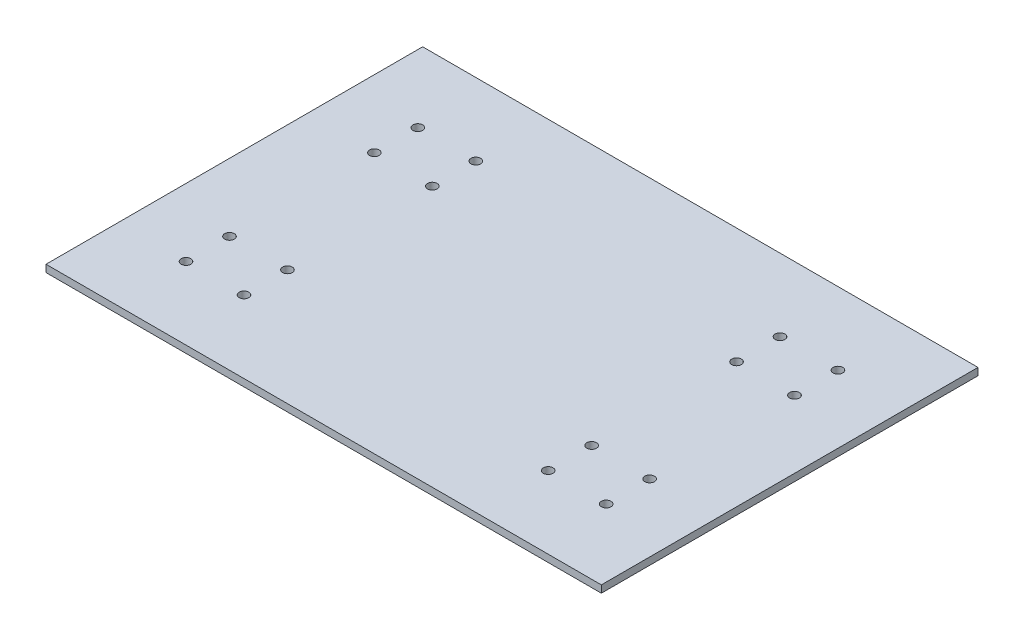
ISO-10303-21;
HEADER;
FILE_DESCRIPTION(('STEP AP214'),'2;1');
FILE_NAME('part.step','',(''),(''),'','','');
FILE_SCHEMA(('AUTOMOTIVE_DESIGN { 1 0 10303 214 1 1 1 1 }'));
ENDSEC;
DATA;
#1=APPLICATION_CONTEXT('core data for automotive mechanical design processes');
#2=APPLICATION_PROTOCOL_DEFINITION('international standard','automotive_design',2000,#1);
#3=PRODUCT_CONTEXT('',#1,'mechanical');
#4=PRODUCT('Part','Part','',(#3));
#5=PRODUCT_RELATED_PRODUCT_CATEGORY('part','',(#4));
#6=PRODUCT_DEFINITION_FORMATION('','',#4);
#7=PRODUCT_DEFINITION_CONTEXT('part definition',#1,'design');
#8=PRODUCT_DEFINITION('design','',#6,#7);
#9=PRODUCT_DEFINITION_SHAPE('','',#8);
#10=(LENGTH_UNIT() NAMED_UNIT(*) SI_UNIT(.MILLI.,.METRE.));
#11=(NAMED_UNIT(*) PLANE_ANGLE_UNIT() SI_UNIT($,.RADIAN.));
#12=(NAMED_UNIT(*) SI_UNIT($,.STERADIAN.) SOLID_ANGLE_UNIT());
#13=UNCERTAINTY_MEASURE_WITH_UNIT(LENGTH_MEASURE(1.E-05),#10,'distance_accuracy_value','');
#14=(GEOMETRIC_REPRESENTATION_CONTEXT(3) GLOBAL_UNCERTAINTY_ASSIGNED_CONTEXT((#13)) GLOBAL_UNIT_ASSIGNED_CONTEXT((#10,
#11,#12)) REPRESENTATION_CONTEXT('',''));
#15=CARTESIAN_POINT('',(0.,0.,0.));
#16=DIRECTION('',(0.,0.,1.));
#17=DIRECTION('',(1.,0.,0.));
#18=AXIS2_PLACEMENT_3D('',#15,#16,#17);
#19=CARTESIAN_POINT('',(115.,3.,78.));
#20=DIRECTION('',(-1.,0.,0.));
#21=DIRECTION('',(0.,0.,1.));
#22=AXIS2_PLACEMENT_3D('',#19,#20,#21);
#23=PLANE('',#22);
#24=DIRECTION('',(0.,0.,-1.));
#25=VECTOR('',#24,1.);
#26=CARTESIAN_POINT('',(115.,0.,78.));
#27=LINE('',#26,#25);
#28=CARTESIAN_POINT('',(115.,0.,78.));
#29=VERTEX_POINT('',#28);
#30=CARTESIAN_POINT('',(115.,0.,-78.));
#31=VERTEX_POINT('',#30);
#32=EDGE_CURVE('E96',#29,#31,#27,.T.);
#33=ORIENTED_EDGE('',*,*,#32,.T.);
#34=DIRECTION('',(0.,-1.,0.));
#35=VECTOR('',#34,1.);
#36=CARTESIAN_POINT('',(115.,3.,-78.));
#37=LINE('',#36,#35);
#38=CARTESIAN_POINT('',(115.,3.,-78.));
#39=VERTEX_POINT('',#38);
#40=EDGE_CURVE('E11',#39,#31,#37,.T.);
#41=ORIENTED_EDGE('',*,*,#40,.F.);
#42=DIRECTION('',(0.,0.,-1.));
#43=VECTOR('',#42,1.);
#44=CARTESIAN_POINT('',(115.,3.,78.));
#45=LINE('',#44,#43);
#46=CARTESIAN_POINT('',(115.,3.,78.));
#47=VERTEX_POINT('',#46);
#48=EDGE_CURVE('E84',#47,#39,#45,.T.);
#49=ORIENTED_EDGE('',*,*,#48,.F.);
#50=DIRECTION('',(0.,-1.,0.));
#51=VECTOR('',#50,1.);
#52=CARTESIAN_POINT('',(115.,3.,78.));
#53=LINE('',#52,#51);
#54=EDGE_CURVE('E92',#47,#29,#53,.T.);
#55=ORIENTED_EDGE('',*,*,#54,.T.);
#56=EDGE_LOOP('',(#33,#41,#49,#55));
#57=FACE_BOUND('',#56,.T.);
#58=ADVANCED_FACE('F33',(#57),#23,.F.);
#59=CARTESIAN_POINT('',(-115.,3.,-78.));
#60=DIRECTION('',(0.,0.,1.));
#61=DIRECTION('',(1.,0.,0.));
#62=AXIS2_PLACEMENT_3D('',#59,#60,#61);
#63=PLANE('',#62);
#64=DIRECTION('',(-1.,0.,0.));
#65=VECTOR('',#64,1.);
#66=CARTESIAN_POINT('',(-115.,0.,-78.));
#67=LINE('',#66,#65);
#68=CARTESIAN_POINT('',(-115.,0.,-78.));
#69=VERTEX_POINT('',#68);
#70=EDGE_CURVE('E88',#31,#69,#67,.T.);
#71=ORIENTED_EDGE('',*,*,#70,.T.);
#72=DIRECTION('',(0.,-1.,0.));
#73=VECTOR('',#72,1.);
#74=CARTESIAN_POINT('',(-115.,3.,-78.));
#75=LINE('',#74,#73);
#76=CARTESIAN_POINT('',(-115.,3.,-78.));
#77=VERTEX_POINT('',#76);
#78=EDGE_CURVE('E41',#77,#69,#75,.T.);
#79=ORIENTED_EDGE('',*,*,#78,.F.);
#80=DIRECTION('',(-1.,0.,0.));
#81=VECTOR('',#80,1.);
#82=CARTESIAN_POINT('',(-115.,3.,-78.));
#83=LINE('',#82,#81);
#84=EDGE_CURVE('E79',#39,#77,#83,.T.);
#85=ORIENTED_EDGE('',*,*,#84,.F.);
#86=ORIENTED_EDGE('',*,*,#40,.T.);
#87=EDGE_LOOP('',(#71,#79,#85,#86));
#88=FACE_BOUND('',#87,.T.);
#89=ADVANCED_FACE('F87',(#88),#63,.F.);
#90=CARTESIAN_POINT('',(-115.,3.,78.));
#91=DIRECTION('',(1.,0.,0.));
#92=DIRECTION('',(0.,0.,-1.));
#93=AXIS2_PLACEMENT_3D('',#90,#91,#92);
#94=PLANE('',#93);
#95=DIRECTION('',(0.,0.,1.));
#96=VECTOR('',#95,1.);
#97=CARTESIAN_POINT('',(-115.,0.,78.));
#98=LINE('',#97,#96);
#99=CARTESIAN_POINT('',(-115.,0.,78.));
#100=VERTEX_POINT('',#99);
#101=EDGE_CURVE('E66',#69,#100,#98,.T.);
#102=ORIENTED_EDGE('',*,*,#101,.T.);
#103=DIRECTION('',(0.,-1.,0.));
#104=VECTOR('',#103,1.);
#105=CARTESIAN_POINT('',(-115.,3.,78.));
#106=LINE('',#105,#104);
#107=CARTESIAN_POINT('',(-115.,3.,78.));
#108=VERTEX_POINT('',#107);
#109=EDGE_CURVE('E89',#108,#100,#106,.T.);
#110=ORIENTED_EDGE('',*,*,#109,.F.);
#111=DIRECTION('',(0.,0.,1.));
#112=VECTOR('',#111,1.);
#113=CARTESIAN_POINT('',(-115.,3.,78.));
#114=LINE('',#113,#112);
#115=EDGE_CURVE('E82',#77,#108,#114,.T.);
#116=ORIENTED_EDGE('',*,*,#115,.F.);
#117=ORIENTED_EDGE('',*,*,#78,.T.);
#118=EDGE_LOOP('',(#102,#110,#116,#117));
#119=FACE_BOUND('',#118,.T.);
#120=ADVANCED_FACE('F90',(#119),#94,.F.);
#121=CARTESIAN_POINT('',(-115.,3.,78.));
#122=DIRECTION('',(0.,0.,-1.));
#123=DIRECTION('',(-1.,0.,0.));
#124=AXIS2_PLACEMENT_3D('',#121,#122,#123);
#125=PLANE('',#124);
#126=DIRECTION('',(1.,0.,0.));
#127=VECTOR('',#126,1.);
#128=CARTESIAN_POINT('',(-115.,0.,78.));
#129=LINE('',#128,#127);
#130=EDGE_CURVE('E72',#100,#29,#129,.T.);
#131=ORIENTED_EDGE('',*,*,#130,.T.);
#132=ORIENTED_EDGE('',*,*,#54,.F.);
#133=DIRECTION('',(1.,0.,0.));
#134=VECTOR('',#133,1.);
#135=CARTESIAN_POINT('',(-115.,3.,78.));
#136=LINE('',#135,#134);
#137=EDGE_CURVE('E49',#108,#47,#136,.T.);
#138=ORIENTED_EDGE('',*,*,#137,.F.);
#139=ORIENTED_EDGE('',*,*,#109,.T.);
#140=EDGE_LOOP('',(#131,#132,#138,#139));
#141=FACE_BOUND('',#140,.T.);
#142=ADVANCED_FACE('F104',(#141),#125,.F.);
#143=CARTESIAN_POINT('',(0.,3.,0.));
#144=DIRECTION('',(0.,-1.,0.));
#145=DIRECTION('',(0.,0.,-1.));
#146=AXIS2_PLACEMENT_3D('',#143,#144,#145);
#147=PLANE('',#146);
#148=CARTESIAN_POINT('',(-63.0000000000003,3.,47.9999999999995));
#149=DIRECTION('',(0.,1.,0.));
#150=DIRECTION('',(0.,0.,1.));
#151=AXIS2_PLACEMENT_3D('',#148,#149,#150);
#152=CIRCLE('',#151,2.);
#153=CARTESIAN_POINT('',(-63.0000000000003,3.,49.9999999999995));
#154=VERTEX_POINT('',#153);
#155=EDGE_CURVE('E140',#154,#154,#152,.T.);
#156=ORIENTED_EDGE('',*,*,#155,.F.);
#157=EDGE_LOOP('',(#156));
#158=FACE_BOUND('',#157,.T.);
#159=CARTESIAN_POINT('',(-63.0000000000003,3.,-47.9999999999995));
#160=DIRECTION('',(0.,1.,0.));
#161=DIRECTION('',(0.,0.,-1.));
#162=AXIS2_PLACEMENT_3D('',#159,#160,#161);
#163=CIRCLE('',#162,2.);
#164=CARTESIAN_POINT('',(-63.0000000000003,3.,-49.9999999999995));
#165=VERTEX_POINT('',#164);
#166=EDGE_CURVE('E147',#165,#165,#163,.T.);
#167=ORIENTED_EDGE('',*,*,#166,.F.);
#168=EDGE_LOOP('',(#167));
#169=FACE_BOUND('',#168,.T.);
#170=CARTESIAN_POINT('',(-87.0000000000003,3.,-47.9999999999995));
#171=DIRECTION('',(0.,1.,0.));
#172=DIRECTION('',(0.,0.,-1.));
#173=AXIS2_PLACEMENT_3D('',#170,#171,#172);
#174=CIRCLE('',#173,2.);
#175=CARTESIAN_POINT('',(-87.0000000000003,3.,-49.9999999999995));
#176=VERTEX_POINT('',#175);
#177=EDGE_CURVE('E153',#176,#176,#174,.T.);
#178=ORIENTED_EDGE('',*,*,#177,.F.);
#179=EDGE_LOOP('',(#178));
#180=FACE_BOUND('',#179,.T.);
#181=CARTESIAN_POINT('',(-87.0000000000002,3.,-29.9999999999995));
#182=DIRECTION('',(0.,1.,0.));
#183=DIRECTION('',(0.,0.,-1.));
#184=AXIS2_PLACEMENT_3D('',#181,#182,#183);
#185=CIRCLE('',#184,2.);
#186=CARTESIAN_POINT('',(-87.0000000000002,3.,-31.9999999999995));
#187=VERTEX_POINT('',#186);
#188=EDGE_CURVE('E159',#187,#187,#185,.T.);
#189=ORIENTED_EDGE('',*,*,#188,.F.);
#190=EDGE_LOOP('',(#189));
#191=FACE_BOUND('',#190,.T.);
#192=CARTESIAN_POINT('',(63.,3.,-47.9999999999999));
#193=DIRECTION('',(0.,1.,0.));
#194=DIRECTION('',(0.,0.,1.));
#195=AXIS2_PLACEMENT_3D('',#192,#193,#194);
#196=CIRCLE('',#195,2.);
#197=CARTESIAN_POINT('',(63.,3.,-45.9999999999999));
#198=VERTEX_POINT('',#197);
#199=EDGE_CURVE('E123',#198,#198,#196,.T.);
#200=ORIENTED_EDGE('',*,*,#199,.F.);
#201=EDGE_LOOP('',(#200));
#202=FACE_BOUND('',#201,.T.);
#203=CARTESIAN_POINT('',(87.,3.,-29.9999999999999));
#204=DIRECTION('',(0.,1.,0.));
#205=DIRECTION('',(0.,0.,1.));
#206=AXIS2_PLACEMENT_3D('',#203,#204,#205);
#207=CIRCLE('',#206,2.);
#208=CARTESIAN_POINT('',(87.,3.,-27.9999999999999));
#209=VERTEX_POINT('',#208);
#210=EDGE_CURVE('E116',#209,#209,#207,.T.);
#211=ORIENTED_EDGE('',*,*,#210,.F.);
#212=EDGE_LOOP('',(#211));
#213=FACE_BOUND('',#212,.T.);
#214=CARTESIAN_POINT('',(63.,3.,-29.9999999999999));
#215=DIRECTION('',(0.,1.,0.));
#216=DIRECTION('',(0.,0.,1.));
#217=AXIS2_PLACEMENT_3D('',#214,#215,#216);
#218=CIRCLE('',#217,2.);
#219=CARTESIAN_POINT('',(63.,3.,-27.9999999999999));
#220=VERTEX_POINT('',#219);
#221=EDGE_CURVE('E135',#220,#220,#218,.T.);
#222=ORIENTED_EDGE('',*,*,#221,.F.);
#223=EDGE_LOOP('',(#222));
#224=FACE_BOUND('',#223,.T.);
#225=CARTESIAN_POINT('',(-63.0000000000002,3.,-29.9999999999995));
#226=DIRECTION('',(0.,1.,0.));
#227=DIRECTION('',(0.,0.,-1.));
#228=AXIS2_PLACEMENT_3D('',#225,#226,#227);
#229=CIRCLE('',#228,2.);
#230=CARTESIAN_POINT('',(-63.0000000000002,3.,-31.9999999999995));
#231=VERTEX_POINT('',#230);
#232=EDGE_CURVE('E128',#231,#231,#229,.T.);
#233=ORIENTED_EDGE('',*,*,#232,.F.);
#234=EDGE_LOOP('',(#233));
#235=FACE_BOUND('',#234,.T.);
#236=CARTESIAN_POINT('',(63.,3.,47.9999999999999));
#237=DIRECTION('',(0.,1.,0.));
#238=DIRECTION('',(0.,0.,-1.));
#239=AXIS2_PLACEMENT_3D('',#236,#237,#238);
#240=CIRCLE('',#239,2.);
#241=CARTESIAN_POINT('',(63.,3.,45.9999999999999));
#242=VERTEX_POINT('',#241);
#243=EDGE_CURVE('E188',#242,#242,#240,.T.);
#244=ORIENTED_EDGE('',*,*,#243,.F.);
#245=EDGE_LOOP('',(#244));
#246=FACE_BOUND('',#245,.T.);
#247=CARTESIAN_POINT('',(87.,3.,47.9999999999999));
#248=DIRECTION('',(0.,1.,0.));
#249=DIRECTION('',(0.,0.,-1.));
#250=AXIS2_PLACEMENT_3D('',#247,#248,#249);
#251=CIRCLE('',#250,2.);
#252=CARTESIAN_POINT('',(87.,3.,45.9999999999999));
#253=VERTEX_POINT('',#252);
#254=EDGE_CURVE('E194',#253,#253,#251,.T.);
#255=ORIENTED_EDGE('',*,*,#254,.F.);
#256=EDGE_LOOP('',(#255));
#257=FACE_BOUND('',#256,.T.);
#258=CARTESIAN_POINT('',(87.,3.,29.9999999999999));
#259=DIRECTION('',(0.,1.,0.));
#260=DIRECTION('',(0.,0.,-1.));
#261=AXIS2_PLACEMENT_3D('',#258,#259,#260);
#262=CIRCLE('',#261,2.);
#263=CARTESIAN_POINT('',(87.,3.,27.9999999999999));
#264=VERTEX_POINT('',#263);
#265=EDGE_CURVE('E200',#264,#264,#262,.T.);
#266=ORIENTED_EDGE('',*,*,#265,.F.);
#267=EDGE_LOOP('',(#266));
#268=FACE_BOUND('',#267,.T.);
#269=CARTESIAN_POINT('',(63.,3.,29.9999999999999));
#270=DIRECTION('',(0.,1.,0.));
#271=DIRECTION('',(0.,0.,-1.));
#272=AXIS2_PLACEMENT_3D('',#269,#270,#271);
#273=CIRCLE('',#272,2.);
#274=CARTESIAN_POINT('',(63.,3.,27.9999999999999));
#275=VERTEX_POINT('',#274);
#276=EDGE_CURVE('E164',#275,#275,#273,.T.);
#277=ORIENTED_EDGE('',*,*,#276,.F.);
#278=EDGE_LOOP('',(#277));
#279=FACE_BOUND('',#278,.T.);
#280=CARTESIAN_POINT('',(-63.0000000000002,3.,29.9999999999995));
#281=DIRECTION('',(0.,1.,0.));
#282=DIRECTION('',(0.,0.,1.));
#283=AXIS2_PLACEMENT_3D('',#280,#281,#282);
#284=CIRCLE('',#283,2.);
#285=CARTESIAN_POINT('',(-63.0000000000002,3.,31.9999999999995));
#286=VERTEX_POINT('',#285);
#287=EDGE_CURVE('E171',#286,#286,#284,.T.);
#288=ORIENTED_EDGE('',*,*,#287,.F.);
#289=EDGE_LOOP('',(#288));
#290=FACE_BOUND('',#289,.T.);
#291=CARTESIAN_POINT('',(-87.0000000000002,3.,29.9999999999995));
#292=DIRECTION('',(0.,1.,0.));
#293=DIRECTION('',(0.,0.,1.));
#294=AXIS2_PLACEMENT_3D('',#291,#292,#293);
#295=CIRCLE('',#294,2.);
#296=CARTESIAN_POINT('',(-87.0000000000002,3.,31.9999999999995));
#297=VERTEX_POINT('',#296);
#298=EDGE_CURVE('E177',#297,#297,#295,.T.);
#299=ORIENTED_EDGE('',*,*,#298,.F.);
#300=EDGE_LOOP('',(#299));
#301=FACE_BOUND('',#300,.T.);
#302=CARTESIAN_POINT('',(-87.0000000000003,3.,47.9999999999995));
#303=DIRECTION('',(0.,1.,0.));
#304=DIRECTION('',(0.,0.,1.));
#305=AXIS2_PLACEMENT_3D('',#302,#303,#304);
#306=CIRCLE('',#305,2.);
#307=CARTESIAN_POINT('',(-87.0000000000003,3.,49.9999999999995));
#308=VERTEX_POINT('',#307);
#309=EDGE_CURVE('E183',#308,#308,#306,.T.);
#310=ORIENTED_EDGE('',*,*,#309,.F.);
#311=EDGE_LOOP('',(#310));
#312=FACE_BOUND('',#311,.T.);
#313=CARTESIAN_POINT('',(87.,3.,-47.9999999999999));
#314=DIRECTION('',(0.,1.,0.));
#315=DIRECTION('',(0.,0.,1.));
#316=AXIS2_PLACEMENT_3D('',#313,#314,#315);
#317=CIRCLE('',#316,2.);
#318=CARTESIAN_POINT('',(87.,3.,-45.9999999999999));
#319=VERTEX_POINT('',#318);
#320=EDGE_CURVE('E110',#319,#319,#317,.T.);
#321=ORIENTED_EDGE('',*,*,#320,.F.);
#322=EDGE_LOOP('',(#321));
#323=FACE_BOUND('',#322,.T.);
#324=ORIENTED_EDGE('',*,*,#48,.T.);
#325=ORIENTED_EDGE('',*,*,#84,.T.);
#326=ORIENTED_EDGE('',*,*,#115,.T.);
#327=ORIENTED_EDGE('',*,*,#137,.T.);
#328=EDGE_LOOP('',(#324,#325,#326,#327));
#329=FACE_BOUND('',#328,.T.);
#330=ADVANCED_FACE('F80',(#158,#169,#180,#191,#202,#213,#224,#235,#246,#257,#268,#279,#290,#301,
#312,#323,#329),#147,.F.);
#331=CARTESIAN_POINT('',(0.,0.,0.));
#332=DIRECTION('',(0.,-1.,0.));
#333=DIRECTION('',(0.,0.,-1.));
#334=AXIS2_PLACEMENT_3D('',#331,#332,#333);
#335=PLANE('',#334);
#336=CARTESIAN_POINT('',(-63.0000000000003,0.,47.9999999999995));
#337=DIRECTION('',(0.,1.,0.));
#338=DIRECTION('',(0.,0.,1.));
#339=AXIS2_PLACEMENT_3D('',#336,#337,#338);
#340=CIRCLE('',#339,2.);
#341=CARTESIAN_POINT('',(-63.0000000000003,0.,49.9999999999995));
#342=VERTEX_POINT('',#341);
#343=EDGE_CURVE('E143',#342,#342,#340,.T.);
#344=ORIENTED_EDGE('',*,*,#343,.T.);
#345=EDGE_LOOP('',(#344));
#346=FACE_BOUND('',#345,.T.);
#347=CARTESIAN_POINT('',(-63.0000000000003,0.,-47.9999999999995));
#348=DIRECTION('',(0.,1.,0.));
#349=DIRECTION('',(0.,0.,-1.));
#350=AXIS2_PLACEMENT_3D('',#347,#348,#349);
#351=CIRCLE('',#350,2.);
#352=CARTESIAN_POINT('',(-63.0000000000003,0.,-49.9999999999995));
#353=VERTEX_POINT('',#352);
#354=EDGE_CURVE('E150',#353,#353,#351,.T.);
#355=ORIENTED_EDGE('',*,*,#354,.T.);
#356=EDGE_LOOP('',(#355));
#357=FACE_BOUND('',#356,.T.);
#358=CARTESIAN_POINT('',(-87.0000000000003,0.,-47.9999999999995));
#359=DIRECTION('',(0.,1.,0.));
#360=DIRECTION('',(0.,0.,-1.));
#361=AXIS2_PLACEMENT_3D('',#358,#359,#360);
#362=CIRCLE('',#361,2.);
#363=CARTESIAN_POINT('',(-87.0000000000003,0.,-49.9999999999995));
#364=VERTEX_POINT('',#363);
#365=EDGE_CURVE('E156',#364,#364,#362,.T.);
#366=ORIENTED_EDGE('',*,*,#365,.T.);
#367=EDGE_LOOP('',(#366));
#368=FACE_BOUND('',#367,.T.);
#369=CARTESIAN_POINT('',(-87.0000000000002,0.,-29.9999999999995));
#370=DIRECTION('',(0.,1.,0.));
#371=DIRECTION('',(0.,0.,-1.));
#372=AXIS2_PLACEMENT_3D('',#369,#370,#371);
#373=CIRCLE('',#372,2.);
#374=CARTESIAN_POINT('',(-87.0000000000002,0.,-31.9999999999995));
#375=VERTEX_POINT('',#374);
#376=EDGE_CURVE('E132',#375,#375,#373,.T.);
#377=ORIENTED_EDGE('',*,*,#376,.T.);
#378=EDGE_LOOP('',(#377));
#379=FACE_BOUND('',#378,.T.);
#380=CARTESIAN_POINT('',(63.,0.,-47.9999999999999));
#381=DIRECTION('',(0.,1.,0.));
#382=DIRECTION('',(0.,0.,1.));
#383=AXIS2_PLACEMENT_3D('',#380,#381,#382);
#384=CIRCLE('',#383,2.);
#385=CARTESIAN_POINT('',(63.,0.,-45.9999999999999));
#386=VERTEX_POINT('',#385);
#387=EDGE_CURVE('E113',#386,#386,#384,.T.);
#388=ORIENTED_EDGE('',*,*,#387,.T.);
#389=EDGE_LOOP('',(#388));
#390=FACE_BOUND('',#389,.T.);
#391=CARTESIAN_POINT('',(87.,0.,-29.9999999999999));
#392=DIRECTION('',(0.,1.,0.));
#393=DIRECTION('',(0.,0.,1.));
#394=AXIS2_PLACEMENT_3D('',#391,#392,#393);
#395=CIRCLE('',#394,2.);
#396=CARTESIAN_POINT('',(87.,0.,-27.9999999999999));
#397=VERTEX_POINT('',#396);
#398=EDGE_CURVE('E119',#397,#397,#395,.T.);
#399=ORIENTED_EDGE('',*,*,#398,.T.);
#400=EDGE_LOOP('',(#399));
#401=FACE_BOUND('',#400,.T.);
#402=CARTESIAN_POINT('',(63.,0.,-29.9999999999999));
#403=DIRECTION('',(0.,1.,0.));
#404=DIRECTION('',(0.,0.,1.));
#405=AXIS2_PLACEMENT_3D('',#402,#403,#404);
#406=CIRCLE('',#405,2.);
#407=CARTESIAN_POINT('',(63.,0.,-27.9999999999999));
#408=VERTEX_POINT('',#407);
#409=EDGE_CURVE('E120',#408,#408,#406,.T.);
#410=ORIENTED_EDGE('',*,*,#409,.T.);
#411=EDGE_LOOP('',(#410));
#412=FACE_BOUND('',#411,.T.);
#413=CARTESIAN_POINT('',(-63.0000000000002,0.,-29.9999999999995));
#414=DIRECTION('',(0.,1.,0.));
#415=DIRECTION('',(0.,0.,-1.));
#416=AXIS2_PLACEMENT_3D('',#413,#414,#415);
#417=CIRCLE('',#416,2.);
#418=CARTESIAN_POINT('',(-63.0000000000002,0.,-31.9999999999995));
#419=VERTEX_POINT('',#418);
#420=EDGE_CURVE('E131',#419,#419,#417,.T.);
#421=ORIENTED_EDGE('',*,*,#420,.T.);
#422=EDGE_LOOP('',(#421));
#423=FACE_BOUND('',#422,.T.);
#424=CARTESIAN_POINT('',(63.,0.,47.9999999999999));
#425=DIRECTION('',(0.,1.,0.));
#426=DIRECTION('',(0.,0.,-1.));
#427=AXIS2_PLACEMENT_3D('',#424,#425,#426);
#428=CIRCLE('',#427,2.);
#429=CARTESIAN_POINT('',(63.,0.,45.9999999999999));
#430=VERTEX_POINT('',#429);
#431=EDGE_CURVE('E191',#430,#430,#428,.T.);
#432=ORIENTED_EDGE('',*,*,#431,.T.);
#433=EDGE_LOOP('',(#432));
#434=FACE_BOUND('',#433,.T.);
#435=CARTESIAN_POINT('',(87.,0.,47.9999999999999));
#436=DIRECTION('',(0.,1.,0.));
#437=DIRECTION('',(0.,0.,-1.));
#438=AXIS2_PLACEMENT_3D('',#435,#436,#437);
#439=CIRCLE('',#438,2.);
#440=CARTESIAN_POINT('',(87.,0.,45.9999999999999));
#441=VERTEX_POINT('',#440);
#442=EDGE_CURVE('E197',#441,#441,#439,.T.);
#443=ORIENTED_EDGE('',*,*,#442,.T.);
#444=EDGE_LOOP('',(#443));
#445=FACE_BOUND('',#444,.T.);
#446=CARTESIAN_POINT('',(87.,0.,29.9999999999999));
#447=DIRECTION('',(0.,1.,0.));
#448=DIRECTION('',(0.,0.,-1.));
#449=AXIS2_PLACEMENT_3D('',#446,#447,#448);
#450=CIRCLE('',#449,2.);
#451=CARTESIAN_POINT('',(87.,0.,27.9999999999999));
#452=VERTEX_POINT('',#451);
#453=EDGE_CURVE('E168',#452,#452,#450,.T.);
#454=ORIENTED_EDGE('',*,*,#453,.T.);
#455=EDGE_LOOP('',(#454));
#456=FACE_BOUND('',#455,.T.);
#457=CARTESIAN_POINT('',(63.,0.,29.9999999999999));
#458=DIRECTION('',(0.,1.,0.));
#459=DIRECTION('',(0.,0.,-1.));
#460=AXIS2_PLACEMENT_3D('',#457,#458,#459);
#461=CIRCLE('',#460,2.);
#462=CARTESIAN_POINT('',(63.,0.,27.9999999999999));
#463=VERTEX_POINT('',#462);
#464=EDGE_CURVE('E167',#463,#463,#461,.T.);
#465=ORIENTED_EDGE('',*,*,#464,.T.);
#466=EDGE_LOOP('',(#465));
#467=FACE_BOUND('',#466,.T.);
#468=CARTESIAN_POINT('',(-63.0000000000002,0.,29.9999999999995));
#469=DIRECTION('',(0.,1.,0.));
#470=DIRECTION('',(0.,0.,1.));
#471=AXIS2_PLACEMENT_3D('',#468,#469,#470);
#472=CIRCLE('',#471,2.);
#473=CARTESIAN_POINT('',(-63.0000000000002,0.,31.9999999999995));
#474=VERTEX_POINT('',#473);
#475=EDGE_CURVE('E174',#474,#474,#472,.T.);
#476=ORIENTED_EDGE('',*,*,#475,.T.);
#477=EDGE_LOOP('',(#476));
#478=FACE_BOUND('',#477,.T.);
#479=CARTESIAN_POINT('',(-87.0000000000002,0.,29.9999999999995));
#480=DIRECTION('',(0.,1.,0.));
#481=DIRECTION('',(0.,0.,1.));
#482=AXIS2_PLACEMENT_3D('',#479,#480,#481);
#483=CIRCLE('',#482,2.);
#484=CARTESIAN_POINT('',(-87.0000000000002,0.,31.9999999999995));
#485=VERTEX_POINT('',#484);
#486=EDGE_CURVE('E180',#485,#485,#483,.T.);
#487=ORIENTED_EDGE('',*,*,#486,.T.);
#488=EDGE_LOOP('',(#487));
#489=FACE_BOUND('',#488,.T.);
#490=CARTESIAN_POINT('',(-87.0000000000003,0.,47.9999999999995));
#491=DIRECTION('',(0.,1.,0.));
#492=DIRECTION('',(0.,0.,1.));
#493=AXIS2_PLACEMENT_3D('',#490,#491,#492);
#494=CIRCLE('',#493,2.);
#495=CARTESIAN_POINT('',(-87.0000000000003,0.,49.9999999999995));
#496=VERTEX_POINT('',#495);
#497=EDGE_CURVE('E144',#496,#496,#494,.T.);
#498=ORIENTED_EDGE('',*,*,#497,.T.);
#499=EDGE_LOOP('',(#498));
#500=FACE_BOUND('',#499,.T.);
#501=CARTESIAN_POINT('',(87.,0.,-47.9999999999999));
#502=DIRECTION('',(0.,1.,0.));
#503=DIRECTION('',(0.,0.,1.));
#504=AXIS2_PLACEMENT_3D('',#501,#502,#503);
#505=CIRCLE('',#504,2.);
#506=CARTESIAN_POINT('',(87.,0.,-45.9999999999999));
#507=VERTEX_POINT('',#506);
#508=EDGE_CURVE('E99',#507,#507,#505,.T.);
#509=ORIENTED_EDGE('',*,*,#508,.T.);
#510=EDGE_LOOP('',(#509));
#511=FACE_BOUND('',#510,.T.);
#512=ORIENTED_EDGE('',*,*,#32,.F.);
#513=ORIENTED_EDGE('',*,*,#130,.F.);
#514=ORIENTED_EDGE('',*,*,#101,.F.);
#515=ORIENTED_EDGE('',*,*,#70,.F.);
#516=EDGE_LOOP('',(#512,#513,#514,#515));
#517=FACE_BOUND('',#516,.T.);
#518=ADVANCED_FACE('F107',(#346,#357,#368,#379,#390,#401,#412,#423,#434,#445,#456,#467,#478,
#489,#500,#511,#517),#335,.T.);
#519=CARTESIAN_POINT('',(87.,0.,-47.9999999999999));
#520=DIRECTION('',(0.,1.,0.));
#521=DIRECTION('',(0.,0.,1.));
#522=AXIS2_PLACEMENT_3D('',#519,#520,#521);
#523=CYLINDRICAL_SURFACE('',#522,2.);
#524=ORIENTED_EDGE('',*,*,#508,.F.);
#525=EDGE_LOOP('',(#524));
#526=FACE_BOUND('',#525,.T.);
#527=ORIENTED_EDGE('',*,*,#320,.T.);
#528=EDGE_LOOP('',(#527));
#529=FACE_BOUND('',#528,.T.);
#530=ADVANCED_FACE('F230',(#526,#529),#523,.F.);
#531=CARTESIAN_POINT('',(-87.0000000000003,0.,47.9999999999995));
#532=DIRECTION('',(0.,1.,0.));
#533=DIRECTION('',(0.,0.,1.));
#534=AXIS2_PLACEMENT_3D('',#531,#532,#533);
#535=CYLINDRICAL_SURFACE('',#534,2.);
#536=ORIENTED_EDGE('',*,*,#497,.F.);
#537=EDGE_LOOP('',(#536));
#538=FACE_BOUND('',#537,.T.);
#539=ORIENTED_EDGE('',*,*,#309,.T.);
#540=EDGE_LOOP('',(#539));
#541=FACE_BOUND('',#540,.T.);
#542=ADVANCED_FACE('F232',(#538,#541),#535,.F.);
#543=CARTESIAN_POINT('',(-87.0000000000002,0.,29.9999999999995));
#544=DIRECTION('',(0.,1.,0.));
#545=DIRECTION('',(0.,0.,1.));
#546=AXIS2_PLACEMENT_3D('',#543,#544,#545);
#547=CYLINDRICAL_SURFACE('',#546,2.);
#548=ORIENTED_EDGE('',*,*,#486,.F.);
#549=EDGE_LOOP('',(#548));
#550=FACE_BOUND('',#549,.T.);
#551=ORIENTED_EDGE('',*,*,#298,.T.);
#552=EDGE_LOOP('',(#551));
#553=FACE_BOUND('',#552,.T.);
#554=ADVANCED_FACE('F239',(#550,#553),#547,.F.);
#555=CARTESIAN_POINT('',(-63.0000000000002,0.,29.9999999999995));
#556=DIRECTION('',(0.,1.,0.));
#557=DIRECTION('',(0.,0.,1.));
#558=AXIS2_PLACEMENT_3D('',#555,#556,#557);
#559=CYLINDRICAL_SURFACE('',#558,2.);
#560=ORIENTED_EDGE('',*,*,#475,.F.);
#561=EDGE_LOOP('',(#560));
#562=FACE_BOUND('',#561,.T.);
#563=ORIENTED_EDGE('',*,*,#287,.T.);
#564=EDGE_LOOP('',(#563));
#565=FACE_BOUND('',#564,.T.);
#566=ADVANCED_FACE('F287',(#562,#565),#559,.F.);
#567=CARTESIAN_POINT('',(63.,0.,29.9999999999999));
#568=DIRECTION('',(0.,1.,0.));
#569=DIRECTION('',(0.,0.,1.));
#570=AXIS2_PLACEMENT_3D('',#567,#568,#569);
#571=CYLINDRICAL_SURFACE('',#570,2.);
#572=ORIENTED_EDGE('',*,*,#464,.F.);
#573=EDGE_LOOP('',(#572));
#574=FACE_BOUND('',#573,.T.);
#575=ORIENTED_EDGE('',*,*,#276,.T.);
#576=EDGE_LOOP('',(#575));
#577=FACE_BOUND('',#576,.T.);
#578=ADVANCED_FACE('F212',(#574,#577),#571,.F.);
#579=CARTESIAN_POINT('',(87.,0.,29.9999999999999));
#580=DIRECTION('',(0.,1.,0.));
#581=DIRECTION('',(0.,0.,1.));
#582=AXIS2_PLACEMENT_3D('',#579,#580,#581);
#583=CYLINDRICAL_SURFACE('',#582,2.);
#584=ORIENTED_EDGE('',*,*,#453,.F.);
#585=EDGE_LOOP('',(#584));
#586=FACE_BOUND('',#585,.T.);
#587=ORIENTED_EDGE('',*,*,#265,.T.);
#588=EDGE_LOOP('',(#587));
#589=FACE_BOUND('',#588,.T.);
#590=ADVANCED_FACE('F208',(#586,#589),#583,.F.);
#591=CARTESIAN_POINT('',(87.,0.,47.9999999999999));
#592=DIRECTION('',(0.,1.,0.));
#593=DIRECTION('',(0.,0.,1.));
#594=AXIS2_PLACEMENT_3D('',#591,#592,#593);
#595=CYLINDRICAL_SURFACE('',#594,2.);
#596=ORIENTED_EDGE('',*,*,#442,.F.);
#597=EDGE_LOOP('',(#596));
#598=FACE_BOUND('',#597,.T.);
#599=ORIENTED_EDGE('',*,*,#254,.T.);
#600=EDGE_LOOP('',(#599));
#601=FACE_BOUND('',#600,.T.);
#602=ADVANCED_FACE('F211',(#598,#601),#595,.F.);
#603=CARTESIAN_POINT('',(63.,0.,47.9999999999999));
#604=DIRECTION('',(0.,1.,0.));
#605=DIRECTION('',(0.,0.,1.));
#606=AXIS2_PLACEMENT_3D('',#603,#604,#605);
#607=CYLINDRICAL_SURFACE('',#606,2.);
#608=ORIENTED_EDGE('',*,*,#431,.F.);
#609=EDGE_LOOP('',(#608));
#610=FACE_BOUND('',#609,.T.);
#611=ORIENTED_EDGE('',*,*,#243,.T.);
#612=EDGE_LOOP('',(#611));
#613=FACE_BOUND('',#612,.T.);
#614=ADVANCED_FACE('F321',(#610,#613),#607,.F.);
#615=CARTESIAN_POINT('',(-63.0000000000002,0.,-29.9999999999995));
#616=DIRECTION('',(0.,1.,0.));
#617=DIRECTION('',(0.,0.,1.));
#618=AXIS2_PLACEMENT_3D('',#615,#616,#617);
#619=CYLINDRICAL_SURFACE('',#618,2.);
#620=ORIENTED_EDGE('',*,*,#420,.F.);
#621=EDGE_LOOP('',(#620));
#622=FACE_BOUND('',#621,.T.);
#623=ORIENTED_EDGE('',*,*,#232,.T.);
#624=EDGE_LOOP('',(#623));
#625=FACE_BOUND('',#624,.T.);
#626=ADVANCED_FACE('F331',(#622,#625),#619,.F.);
#627=CARTESIAN_POINT('',(63.,0.,-29.9999999999999));
#628=DIRECTION('',(0.,1.,0.));
#629=DIRECTION('',(0.,0.,1.));
#630=AXIS2_PLACEMENT_3D('',#627,#628,#629);
#631=CYLINDRICAL_SURFACE('',#630,2.);
#632=ORIENTED_EDGE('',*,*,#409,.F.);
#633=EDGE_LOOP('',(#632));
#634=FACE_BOUND('',#633,.T.);
#635=ORIENTED_EDGE('',*,*,#221,.T.);
#636=EDGE_LOOP('',(#635));
#637=FACE_BOUND('',#636,.T.);
#638=ADVANCED_FACE('F341',(#634,#637),#631,.F.);
#639=CARTESIAN_POINT('',(87.,0.,-29.9999999999999));
#640=DIRECTION('',(0.,1.,0.));
#641=DIRECTION('',(0.,0.,1.));
#642=AXIS2_PLACEMENT_3D('',#639,#640,#641);
#643=CYLINDRICAL_SURFACE('',#642,2.);
#644=ORIENTED_EDGE('',*,*,#398,.F.);
#645=EDGE_LOOP('',(#644));
#646=FACE_BOUND('',#645,.T.);
#647=ORIENTED_EDGE('',*,*,#210,.T.);
#648=EDGE_LOOP('',(#647));
#649=FACE_BOUND('',#648,.T.);
#650=ADVANCED_FACE('F351',(#646,#649),#643,.F.);
#651=CARTESIAN_POINT('',(63.,0.,-47.9999999999999));
#652=DIRECTION('',(0.,1.,0.));
#653=DIRECTION('',(0.,0.,1.));
#654=AXIS2_PLACEMENT_3D('',#651,#652,#653);
#655=CYLINDRICAL_SURFACE('',#654,2.);
#656=ORIENTED_EDGE('',*,*,#387,.F.);
#657=EDGE_LOOP('',(#656));
#658=FACE_BOUND('',#657,.T.);
#659=ORIENTED_EDGE('',*,*,#199,.T.);
#660=EDGE_LOOP('',(#659));
#661=FACE_BOUND('',#660,.T.);
#662=ADVANCED_FACE('F361',(#658,#661),#655,.F.);
#663=CARTESIAN_POINT('',(-87.0000000000002,0.,-29.9999999999995));
#664=DIRECTION('',(0.,1.,0.));
#665=DIRECTION('',(0.,0.,1.));
#666=AXIS2_PLACEMENT_3D('',#663,#664,#665);
#667=CYLINDRICAL_SURFACE('',#666,2.);
#668=ORIENTED_EDGE('',*,*,#376,.F.);
#669=EDGE_LOOP('',(#668));
#670=FACE_BOUND('',#669,.T.);
#671=ORIENTED_EDGE('',*,*,#188,.T.);
#672=EDGE_LOOP('',(#671));
#673=FACE_BOUND('',#672,.T.);
#674=ADVANCED_FACE('F370',(#670,#673),#667,.F.);
#675=CARTESIAN_POINT('',(-87.0000000000003,0.,-47.9999999999995));
#676=DIRECTION('',(0.,1.,0.));
#677=DIRECTION('',(0.,0.,1.));
#678=AXIS2_PLACEMENT_3D('',#675,#676,#677);
#679=CYLINDRICAL_SURFACE('',#678,2.);
#680=ORIENTED_EDGE('',*,*,#365,.F.);
#681=EDGE_LOOP('',(#680));
#682=FACE_BOUND('',#681,.T.);
#683=ORIENTED_EDGE('',*,*,#177,.T.);
#684=EDGE_LOOP('',(#683));
#685=FACE_BOUND('',#684,.T.);
#686=ADVANCED_FACE('F380',(#682,#685),#679,.F.);
#687=CARTESIAN_POINT('',(-63.0000000000003,0.,-47.9999999999995));
#688=DIRECTION('',(0.,1.,0.));
#689=DIRECTION('',(0.,0.,1.));
#690=AXIS2_PLACEMENT_3D('',#687,#688,#689);
#691=CYLINDRICAL_SURFACE('',#690,2.);
#692=ORIENTED_EDGE('',*,*,#354,.F.);
#693=EDGE_LOOP('',(#692));
#694=FACE_BOUND('',#693,.T.);
#695=ORIENTED_EDGE('',*,*,#166,.T.);
#696=EDGE_LOOP('',(#695));
#697=FACE_BOUND('',#696,.T.);
#698=ADVANCED_FACE('F390',(#694,#697),#691,.F.);
#699=CARTESIAN_POINT('',(-63.0000000000003,0.,47.9999999999995));
#700=DIRECTION('',(0.,1.,0.));
#701=DIRECTION('',(0.,0.,1.));
#702=AXIS2_PLACEMENT_3D('',#699,#700,#701);
#703=CYLINDRICAL_SURFACE('',#702,2.);
#704=ORIENTED_EDGE('',*,*,#343,.F.);
#705=EDGE_LOOP('',(#704));
#706=FACE_BOUND('',#705,.T.);
#707=ORIENTED_EDGE('',*,*,#155,.T.);
#708=EDGE_LOOP('',(#707));
#709=FACE_BOUND('',#708,.T.);
#710=ADVANCED_FACE('F400',(#706,#709),#703,.F.);
#711=CLOSED_SHELL('',(#58,#89,#120,#142,#330,#518,#530,#542,#554,#566,#578,#590,#602,#614,#626,
#638,#650,#662,#674,#686,#698,#710));
#712=MANIFOLD_SOLID_BREP('B2',#711);
#713=ADVANCED_BREP_SHAPE_REPRESENTATION('',(#18,#712),#14);
#714=SHAPE_DEFINITION_REPRESENTATION(#9,#713);
ENDSEC;
END-ISO-10303-21;
